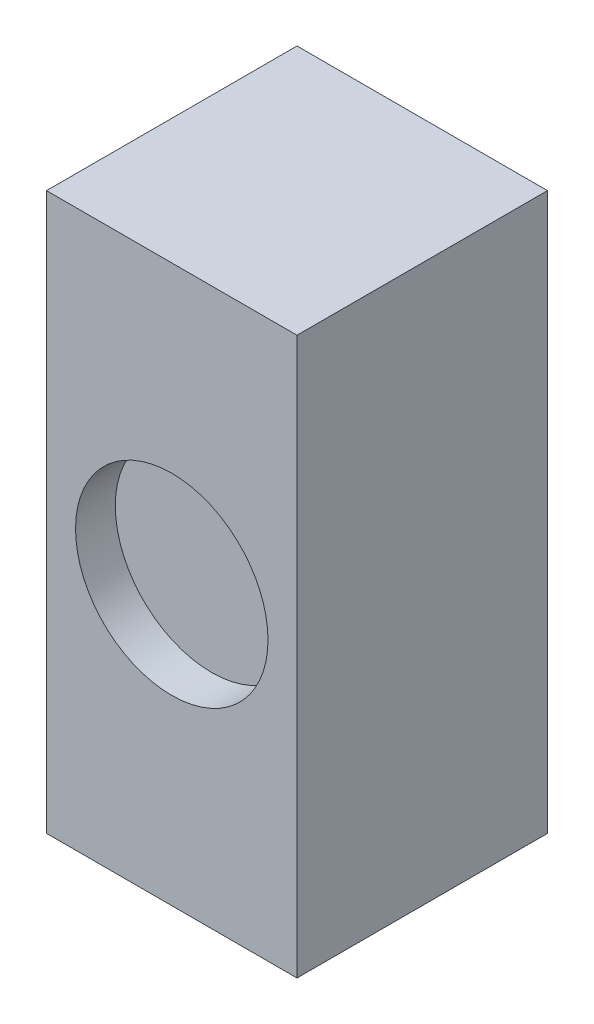
ISO-10303-21;
HEADER;
FILE_DESCRIPTION(('STEP AP214'),'2;1');
FILE_NAME('part.step','',(''),(''),'','','');
FILE_SCHEMA(('AUTOMOTIVE_DESIGN { 1 0 10303 214 1 1 1 1 }'));
ENDSEC;
DATA;
#1=APPLICATION_CONTEXT('core data for automotive mechanical design processes');
#2=APPLICATION_PROTOCOL_DEFINITION('international standard','automotive_design',2000,#1);
#3=PRODUCT_CONTEXT('',#1,'mechanical');
#4=PRODUCT('Part','Part','',(#3));
#5=PRODUCT_RELATED_PRODUCT_CATEGORY('part','',(#4));
#6=PRODUCT_DEFINITION_FORMATION('','',#4);
#7=PRODUCT_DEFINITION_CONTEXT('part definition',#1,'design');
#8=PRODUCT_DEFINITION('design','',#6,#7);
#9=PRODUCT_DEFINITION_SHAPE('','',#8);
#10=(LENGTH_UNIT() NAMED_UNIT(*) SI_UNIT(.MILLI.,.METRE.));
#11=(NAMED_UNIT(*) PLANE_ANGLE_UNIT() SI_UNIT($,.RADIAN.));
#12=(NAMED_UNIT(*) SI_UNIT($,.STERADIAN.) SOLID_ANGLE_UNIT());
#13=UNCERTAINTY_MEASURE_WITH_UNIT(LENGTH_MEASURE(1.E-05),#10,'distance_accuracy_value','');
#14=(GEOMETRIC_REPRESENTATION_CONTEXT(3) GLOBAL_UNCERTAINTY_ASSIGNED_CONTEXT((#13)) GLOBAL_UNIT_ASSIGNED_CONTEXT((#10,
#11,#12)) REPRESENTATION_CONTEXT('',''));
#15=CARTESIAN_POINT('',(0.,0.,0.));
#16=DIRECTION('',(0.,0.,1.));
#17=DIRECTION('',(1.,0.,0.));
#18=AXIS2_PLACEMENT_3D('',#15,#16,#17);
#19=CARTESIAN_POINT('',(-80.,355.6,0.));
#20=DIRECTION('',(1.,0.,0.));
#21=DIRECTION('',(0.,0.,-1.));
#22=AXIS2_PLACEMENT_3D('',#19,#20,#21);
#23=PLANE('',#22);
#24=DIRECTION('',(0.,0.,1.));
#25=VECTOR('',#24,1.);
#26=CARTESIAN_POINT('',(-80.,0.,0.));
#27=LINE('',#26,#25);
#28=CARTESIAN_POINT('',(-80.,0.,-80.));
#29=VERTEX_POINT('',#28);
#30=CARTESIAN_POINT('',(-80.,0.,80.));
#31=VERTEX_POINT('',#30);
#32=EDGE_CURVE('E82',#29,#31,#27,.T.);
#33=ORIENTED_EDGE('',*,*,#32,.T.);
#34=DIRECTION('',(0.,-1.,0.));
#35=VECTOR('',#34,1.);
#36=CARTESIAN_POINT('',(-80.,355.6,80.));
#37=LINE('',#36,#35);
#38=CARTESIAN_POINT('',(-80.,355.6,80.));
#39=VERTEX_POINT('',#38);
#40=EDGE_CURVE('E11',#39,#31,#37,.T.);
#41=ORIENTED_EDGE('',*,*,#40,.F.);
#42=DIRECTION('',(0.,0.,1.));
#43=VECTOR('',#42,1.);
#44=CARTESIAN_POINT('',(-80.,355.6,-80.));
#45=LINE('',#44,#43);
#46=CARTESIAN_POINT('',(-80.,355.6,-80.));
#47=VERTEX_POINT('',#46);
#48=EDGE_CURVE('E86',#47,#39,#45,.T.);
#49=ORIENTED_EDGE('',*,*,#48,.F.);
#50=DIRECTION('',(0.,-1.,0.));
#51=VECTOR('',#50,1.);
#52=CARTESIAN_POINT('',(-80.,355.6,-80.));
#53=LINE('',#52,#51);
#54=EDGE_CURVE('E110',#47,#29,#53,.T.);
#55=ORIENTED_EDGE('',*,*,#54,.T.);
#56=EDGE_LOOP('',(#33,#41,#49,#55));
#57=FACE_BOUND('',#56,.T.);
#58=ADVANCED_FACE('F45',(#57),#23,.F.);
#59=CARTESIAN_POINT('',(80.,355.6,80.));
#60=DIRECTION('',(0.,0.,1.));
#61=DIRECTION('',(1.,0.,0.));
#62=AXIS2_PLACEMENT_3D('',#59,#60,#61);
#63=PLANE('',#62);
#64=CARTESIAN_POINT('',(0.,177.8,80.));
#65=DIRECTION('',(0.,0.,1.));
#66=DIRECTION('',(1.,0.,0.));
#67=AXIS2_PLACEMENT_3D('',#64,#65,#66);
#68=CIRCLE('',#67,61.468);
#69=CARTESIAN_POINT('',(61.468,177.8,80.));
#70=VERTEX_POINT('',#69);
#71=EDGE_CURVE('E133',#70,#70,#68,.T.);
#72=ORIENTED_EDGE('',*,*,#71,.F.);
#73=EDGE_LOOP('',(#72));
#74=FACE_BOUND('',#73,.T.);
#75=DIRECTION('',(-1.,0.,0.));
#76=VECTOR('',#75,1.);
#77=CARTESIAN_POINT('',(80.,0.,80.));
#78=LINE('',#77,#76);
#79=CARTESIAN_POINT('',(80.,0.,80.));
#80=VERTEX_POINT('',#79);
#81=EDGE_CURVE('E101',#80,#31,#78,.T.);
#82=ORIENTED_EDGE('',*,*,#81,.F.);
#83=DIRECTION('',(0.,-1.,0.));
#84=VECTOR('',#83,1.);
#85=CARTESIAN_POINT('',(80.,355.6,80.));
#86=LINE('',#85,#84);
#87=CARTESIAN_POINT('',(80.,355.6,80.));
#88=VERTEX_POINT('',#87);
#89=EDGE_CURVE('E54',#88,#80,#86,.T.);
#90=ORIENTED_EDGE('',*,*,#89,.F.);
#91=DIRECTION('',(1.,0.,0.));
#92=VECTOR('',#91,1.);
#93=CARTESIAN_POINT('',(-80.,355.6,80.));
#94=LINE('',#93,#92);
#95=EDGE_CURVE('E89',#39,#88,#94,.T.);
#96=ORIENTED_EDGE('',*,*,#95,.F.);
#97=ORIENTED_EDGE('',*,*,#40,.T.);
#98=EDGE_LOOP('',(#82,#90,#96,#97));
#99=FACE_BOUND('',#98,.T.);
#100=ADVANCED_FACE('F100',(#74,#99),#63,.T.);
#101=CARTESIAN_POINT('',(80.,355.6,0.));
#102=DIRECTION('',(-1.,0.,0.));
#103=DIRECTION('',(0.,0.,1.));
#104=AXIS2_PLACEMENT_3D('',#101,#102,#103);
#105=PLANE('',#104);
#106=DIRECTION('',(0.,0.,-1.));
#107=VECTOR('',#106,1.);
#108=CARTESIAN_POINT('',(80.,0.,0.));
#109=LINE('',#108,#107);
#110=CARTESIAN_POINT('',(80.,0.,-80.));
#111=VERTEX_POINT('',#110);
#112=EDGE_CURVE('E119',#80,#111,#109,.T.);
#113=ORIENTED_EDGE('',*,*,#112,.T.);
#114=DIRECTION('',(0.,-1.,0.));
#115=VECTOR('',#114,1.);
#116=CARTESIAN_POINT('',(80.,355.6,-80.));
#117=LINE('',#116,#115);
#118=CARTESIAN_POINT('',(80.,355.6,-80.));
#119=VERTEX_POINT('',#118);
#120=EDGE_CURVE('E104',#119,#111,#117,.T.);
#121=ORIENTED_EDGE('',*,*,#120,.F.);
#122=DIRECTION('',(0.,0.,1.));
#123=VECTOR('',#122,1.);
#124=CARTESIAN_POINT('',(80.,355.6,0.));
#125=LINE('',#124,#123);
#126=EDGE_CURVE('E93',#119,#88,#125,.T.);
#127=ORIENTED_EDGE('',*,*,#126,.T.);
#128=ORIENTED_EDGE('',*,*,#89,.T.);
#129=EDGE_LOOP('',(#113,#121,#127,#128));
#130=FACE_BOUND('',#129,.T.);
#131=ADVANCED_FACE('F105',(#130),#105,.F.);
#132=CARTESIAN_POINT('',(0.,355.6,-80.));
#133=DIRECTION('',(0.,0.,1.));
#134=DIRECTION('',(1.,0.,0.));
#135=AXIS2_PLACEMENT_3D('',#132,#133,#134);
#136=PLANE('',#135);
#137=DIRECTION('',(-1.,0.,0.));
#138=VECTOR('',#137,1.);
#139=CARTESIAN_POINT('',(0.,0.,-80.));
#140=LINE('',#139,#138);
#141=EDGE_CURVE('E78',#111,#29,#140,.T.);
#142=ORIENTED_EDGE('',*,*,#141,.T.);
#143=ORIENTED_EDGE('',*,*,#54,.F.);
#144=DIRECTION('',(-1.,0.,0.));
#145=VECTOR('',#144,1.);
#146=CARTESIAN_POINT('',(80.,355.6,-80.));
#147=LINE('',#146,#145);
#148=EDGE_CURVE('E62',#119,#47,#147,.T.);
#149=ORIENTED_EDGE('',*,*,#148,.F.);
#150=ORIENTED_EDGE('',*,*,#120,.T.);
#151=EDGE_LOOP('',(#142,#143,#149,#150));
#152=FACE_BOUND('',#151,.T.);
#153=ADVANCED_FACE('F129',(#152),#136,.F.);
#154=CARTESIAN_POINT('',(0.,355.6,0.));
#155=DIRECTION('',(0.,1.,0.));
#156=DIRECTION('',(0.,0.,1.));
#157=AXIS2_PLACEMENT_3D('',#154,#155,#156);
#158=PLANE('',#157);
#159=ORIENTED_EDGE('',*,*,#48,.T.);
#160=ORIENTED_EDGE('',*,*,#95,.T.);
#161=ORIENTED_EDGE('',*,*,#126,.F.);
#162=ORIENTED_EDGE('',*,*,#148,.T.);
#163=EDGE_LOOP('',(#159,#160,#161,#162));
#164=FACE_BOUND('',#163,.T.);
#165=ADVANCED_FACE('F91',(#164),#158,.T.);
#166=CARTESIAN_POINT('',(0.,0.,0.));
#167=DIRECTION('',(0.,1.,0.));
#168=DIRECTION('',(0.,0.,1.));
#169=AXIS2_PLACEMENT_3D('',#166,#167,#168);
#170=PLANE('',#169);
#171=ORIENTED_EDGE('',*,*,#32,.F.);
#172=ORIENTED_EDGE('',*,*,#141,.F.);
#173=ORIENTED_EDGE('',*,*,#112,.F.);
#174=ORIENTED_EDGE('',*,*,#81,.T.);
#175=EDGE_LOOP('',(#171,#172,#173,#174));
#176=FACE_BOUND('',#175,.T.);
#177=ADVANCED_FACE('F146',(#176),#170,.F.);
#178=CARTESIAN_POINT('',(0.,177.8,54.6));
#179=DIRECTION('',(0.,0.,1.));
#180=DIRECTION('',(1.,0.,0.));
#181=AXIS2_PLACEMENT_3D('',#178,#179,#180);
#182=CYLINDRICAL_SURFACE('',#181,61.468);
#183=CARTESIAN_POINT('',(0.,177.8,54.6));
#184=DIRECTION('',(0.,0.,1.));
#185=DIRECTION('',(1.,0.,0.));
#186=AXIS2_PLACEMENT_3D('',#183,#184,#185);
#187=CIRCLE('',#186,61.468);
#188=CARTESIAN_POINT('',(61.468,177.8,54.6));
#189=VERTEX_POINT('',#188);
#190=EDGE_CURVE('E116',#189,#189,#187,.T.);
#191=CARTESIAN_POINT('',(61.468,177.8,54.6));
#192=CARTESIAN_POINT('',(61.468,177.8,54.8645833333333));
#193=CARTESIAN_POINT('',(61.468,177.8,55.1291666666667));
#194=CARTESIAN_POINT('',(61.468,177.8,55.6583333333333));
#195=CARTESIAN_POINT('',(61.468,177.8,55.9229166666667));
#196=CARTESIAN_POINT('',(61.468,177.8,56.4520833333333));
#197=CARTESIAN_POINT('',(61.468,177.8,56.7166666666667));
#198=CARTESIAN_POINT('',(61.468,177.8,57.2458333333333));
#199=CARTESIAN_POINT('',(61.468,177.8,57.5104166666667));
#200=CARTESIAN_POINT('',(61.468,177.8,58.0395833333333));
#201=CARTESIAN_POINT('',(61.468,177.8,58.3041666666667));
#202=CARTESIAN_POINT('',(61.468,177.8,58.8333333333333));
#203=CARTESIAN_POINT('',(61.468,177.8,59.0979166666667));
#204=CARTESIAN_POINT('',(61.468,177.8,59.6270833333333));
#205=CARTESIAN_POINT('',(61.468,177.8,59.8916666666667));
#206=CARTESIAN_POINT('',(61.468,177.8,60.4208333333333));
#207=CARTESIAN_POINT('',(61.468,177.8,60.6854166666667));
#208=CARTESIAN_POINT('',(61.468,177.8,61.2145833333333));
#209=CARTESIAN_POINT('',(61.468,177.8,61.4791666666667));
#210=CARTESIAN_POINT('',(61.468,177.8,62.0083333333333));
#211=CARTESIAN_POINT('',(61.468,177.8,62.2729166666667));
#212=CARTESIAN_POINT('',(61.468,177.8,62.8020833333333));
#213=CARTESIAN_POINT('',(61.468,177.8,63.0666666666667));
#214=CARTESIAN_POINT('',(61.468,177.8,63.5958333333333));
#215=CARTESIAN_POINT('',(61.468,177.8,63.8604166666667));
#216=CARTESIAN_POINT('',(61.468,177.8,64.3895833333333));
#217=CARTESIAN_POINT('',(61.468,177.8,64.6541666666667));
#218=CARTESIAN_POINT('',(61.468,177.8,65.1833333333333));
#219=CARTESIAN_POINT('',(61.468,177.8,65.4479166666667));
#220=CARTESIAN_POINT('',(61.468,177.8,65.9770833333333));
#221=CARTESIAN_POINT('',(61.468,177.8,66.2416666666667));
#222=CARTESIAN_POINT('',(61.468,177.8,66.7708333333333));
#223=CARTESIAN_POINT('',(61.468,177.8,67.0354166666667));
#224=CARTESIAN_POINT('',(61.468,177.8,67.5645833333333));
#225=CARTESIAN_POINT('',(61.468,177.8,67.8291666666667));
#226=CARTESIAN_POINT('',(61.468,177.8,68.3583333333333));
#227=CARTESIAN_POINT('',(61.468,177.8,68.6229166666667));
#228=CARTESIAN_POINT('',(61.468,177.8,69.1520833333333));
#229=CARTESIAN_POINT('',(61.468,177.8,69.4166666666667));
#230=CARTESIAN_POINT('',(61.468,177.8,69.9458333333333));
#231=CARTESIAN_POINT('',(61.468,177.8,70.2104166666667));
#232=CARTESIAN_POINT('',(61.468,177.8,70.7395833333333));
#233=CARTESIAN_POINT('',(61.468,177.8,71.0041666666667));
#234=CARTESIAN_POINT('',(61.468,177.8,71.5333333333333));
#235=CARTESIAN_POINT('',(61.468,177.8,71.7979166666667));
#236=CARTESIAN_POINT('',(61.468,177.8,72.3270833333333));
#237=CARTESIAN_POINT('',(61.468,177.8,72.5916666666667));
#238=CARTESIAN_POINT('',(61.468,177.8,73.1208333333333));
#239=CARTESIAN_POINT('',(61.468,177.8,73.3854166666667));
#240=CARTESIAN_POINT('',(61.468,177.8,73.9145833333333));
#241=CARTESIAN_POINT('',(61.468,177.8,74.1791666666667));
#242=CARTESIAN_POINT('',(61.468,177.8,74.7083333333333));
#243=CARTESIAN_POINT('',(61.468,177.8,74.9729166666667));
#244=CARTESIAN_POINT('',(61.468,177.8,75.5020833333333));
#245=CARTESIAN_POINT('',(61.468,177.8,75.7666666666667));
#246=CARTESIAN_POINT('',(61.468,177.8,76.2958333333333));
#247=CARTESIAN_POINT('',(61.468,177.8,76.5604166666667));
#248=CARTESIAN_POINT('',(61.468,177.8,77.0895833333333));
#249=CARTESIAN_POINT('',(61.468,177.8,77.3541666666667));
#250=CARTESIAN_POINT('',(61.468,177.8,77.8833333333333));
#251=CARTESIAN_POINT('',(61.468,177.8,78.1479166666667));
#252=CARTESIAN_POINT('',(61.468,177.8,78.6770833333333));
#253=CARTESIAN_POINT('',(61.468,177.8,78.9416666666667));
#254=CARTESIAN_POINT('',(61.468,177.8,79.4708333333333));
#255=CARTESIAN_POINT('',(61.468,177.8,79.7354166666667));
#256=CARTESIAN_POINT('',(61.468,177.8,80.));
#257=B_SPLINE_CURVE_WITH_KNOTS('',3,(#191,#192,#193,#194,#195,#196,#197,#198,#199,#200,#201,
#202,#203,#204,#205,#206,#207,#208,#209,#210,#211,#212,#213,#214,#215,#216,#217,#218,#219,#220,
#221,#222,#223,#224,#225,#226,#227,#228,#229,#230,#231,#232,#233,#234,#235,#236,#237,#238,#239,
#240,#241,#242,#243,#244,#245,#246,#247,#248,#249,#250,#251,#252,#253,#254,#255,#256),
.UNSPECIFIED.,.F.,.F.,(4,2,2,2,2,2,2,2,2,2,2,2,2,2,2,2,2,2,2,2,2,2,2,2,2,2,2,2,2,2,2,2,4),(0.,
0.793749999999996,1.5875,2.38124999999999,3.175,3.96875,4.7625,5.55625,6.34999999999999,7.14375,
7.9375,8.73125,9.52499999999999,10.31875,11.1125,11.90625,12.7,13.49375,14.2875,15.08125,15.875,
16.66875,17.4625,18.25625,19.05,19.84375,20.6375,21.43125,22.225,23.01875,23.8125,24.60625,
25.4),.UNSPECIFIED.);
#258=EDGE_CURVE('BSEAM143',#189,#70,#257,.T.);
#259=ORIENTED_EDGE('',*,*,#190,.F.);
#260=ORIENTED_EDGE('',*,*,#71,.T.);
#261=ORIENTED_EDGE('',*,*,#258,.T.);
#262=ORIENTED_EDGE('',*,*,#258,.F.);
#263=EDGE_LOOP('',(#259,#261,#260,#262));
#264=FACE_BOUND('',#263,.T.);
#265=ADVANCED_FACE('F143',(#264),#182,.F.);
#266=CARTESIAN_POINT('',(0.,177.8,54.6));
#267=DIRECTION('',(0.,0.,1.));
#268=DIRECTION('',(1.,0.,0.));
#269=AXIS2_PLACEMENT_3D('',#266,#267,#268);
#270=PLANE('',#269);
#271=ORIENTED_EDGE('',*,*,#190,.T.);
#272=EDGE_LOOP('',(#271));
#273=FACE_BOUND('',#272,.T.);
#274=ADVANCED_FACE('F141',(#273),#270,.T.);
#275=CLOSED_SHELL('',(#58,#100,#131,#153,#165,#177,#265,#274));
#276=MANIFOLD_SOLID_BREP('B2',#275);
#277=ADVANCED_BREP_SHAPE_REPRESENTATION('',(#18,#276),#14);
#278=SHAPE_DEFINITION_REPRESENTATION(#9,#277);
ENDSEC;
END-ISO-10303-21;
